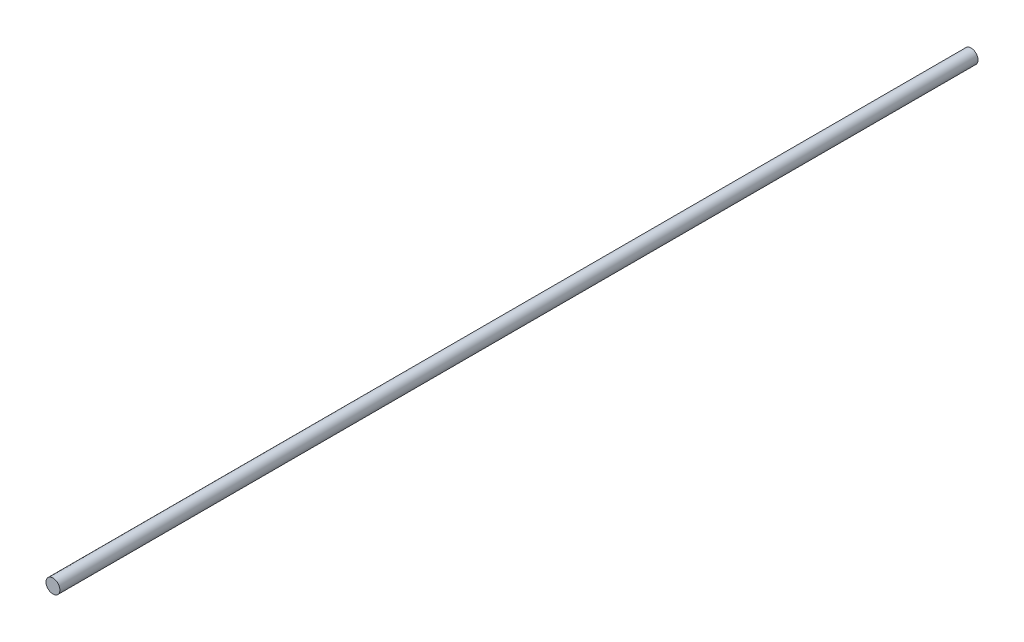
ISO-10303-21;
HEADER;
FILE_DESCRIPTION(('STEP AP214'),'2;1');
FILE_NAME('part.step','',(''),(''),'','','');
FILE_SCHEMA(('AUTOMOTIVE_DESIGN { 1 0 10303 214 1 1 1 1 }'));
ENDSEC;
DATA;
#1=APPLICATION_CONTEXT('core data for automotive mechanical design processes');
#2=APPLICATION_PROTOCOL_DEFINITION('international standard','automotive_design',2000,#1);
#3=PRODUCT_CONTEXT('',#1,'mechanical');
#4=PRODUCT('Part','Part','',(#3));
#5=PRODUCT_RELATED_PRODUCT_CATEGORY('part','',(#4));
#6=PRODUCT_DEFINITION_FORMATION('','',#4);
#7=PRODUCT_DEFINITION_CONTEXT('part definition',#1,'design');
#8=PRODUCT_DEFINITION('design','',#6,#7);
#9=PRODUCT_DEFINITION_SHAPE('','',#8);
#10=(LENGTH_UNIT() NAMED_UNIT(*) SI_UNIT(.MILLI.,.METRE.));
#11=(NAMED_UNIT(*) PLANE_ANGLE_UNIT() SI_UNIT($,.RADIAN.));
#12=(NAMED_UNIT(*) SI_UNIT($,.STERADIAN.) SOLID_ANGLE_UNIT());
#13=UNCERTAINTY_MEASURE_WITH_UNIT(LENGTH_MEASURE(1.E-05),#10,'distance_accuracy_value','');
#14=(GEOMETRIC_REPRESENTATION_CONTEXT(3) GLOBAL_UNCERTAINTY_ASSIGNED_CONTEXT((#13)) GLOBAL_UNIT_ASSIGNED_CONTEXT((#10,
#11,#12)) REPRESENTATION_CONTEXT('',''));
#15=CARTESIAN_POINT('',(0.,0.,0.));
#16=DIRECTION('',(0.,0.,1.));
#17=DIRECTION('',(1.,0.,0.));
#18=AXIS2_PLACEMENT_3D('',#15,#16,#17);
#19=CARTESIAN_POINT('',(0.,0.,660.));
#20=DIRECTION('',(0.,0.,-1.));
#21=DIRECTION('',(-1.,0.,0.));
#22=AXIS2_PLACEMENT_3D('',#19,#20,#21);
#23=CYLINDRICAL_SURFACE('',#22,5.);
#24=CARTESIAN_POINT('',(0.,0.,660.));
#25=DIRECTION('',(0.,0.,1.));
#26=DIRECTION('',(1.,0.,0.));
#27=AXIS2_PLACEMENT_3D('',#24,#25,#26);
#28=CIRCLE('',#27,5.);
#29=CARTESIAN_POINT('',(5.,0.,660.));
#30=VERTEX_POINT('',#29);
#31=EDGE_CURVE('E10',#30,#30,#28,.T.);
#32=ORIENTED_EDGE('',*,*,#31,.F.);
#33=EDGE_LOOP('',(#32));
#34=FACE_BOUND('',#33,.T.);
#35=CARTESIAN_POINT('',(0.,0.,0.));
#36=DIRECTION('',(0.,0.,1.));
#37=DIRECTION('',(1.,0.,0.));
#38=AXIS2_PLACEMENT_3D('',#35,#36,#37);
#39=CIRCLE('',#38,5.);
#40=CARTESIAN_POINT('',(5.,0.,0.));
#41=VERTEX_POINT('',#40);
#42=EDGE_CURVE('E40',#41,#41,#39,.T.);
#43=ORIENTED_EDGE('',*,*,#42,.T.);
#44=EDGE_LOOP('',(#43));
#45=FACE_BOUND('',#44,.T.);
#46=ADVANCED_FACE('F37',(#34,#45),#23,.T.);
#47=CARTESIAN_POINT('',(0.,0.,660.));
#48=DIRECTION('',(0.,0.,1.));
#49=DIRECTION('',(1.,0.,0.));
#50=AXIS2_PLACEMENT_3D('',#47,#48,#49);
#51=PLANE('',#50);
#52=ORIENTED_EDGE('',*,*,#31,.T.);
#53=EDGE_LOOP('',(#52));
#54=FACE_BOUND('',#53,.T.);
#55=ADVANCED_FACE('F52',(#54),#51,.T.);
#56=CARTESIAN_POINT('',(0.,0.,0.));
#57=DIRECTION('',(0.,0.,1.));
#58=DIRECTION('',(1.,0.,0.));
#59=AXIS2_PLACEMENT_3D('',#56,#57,#58);
#60=PLANE('',#59);
#61=ORIENTED_EDGE('',*,*,#42,.F.);
#62=EDGE_LOOP('',(#61));
#63=FACE_BOUND('',#62,.T.);
#64=ADVANCED_FACE('F50',(#63),#60,.F.);
#65=CLOSED_SHELL('',(#46,#55,#64));
#66=MANIFOLD_SOLID_BREP('B2',#65);
#67=ADVANCED_BREP_SHAPE_REPRESENTATION('',(#18,#66),#14);
#68=SHAPE_DEFINITION_REPRESENTATION(#9,#67);
ENDSEC;
END-ISO-10303-21;
